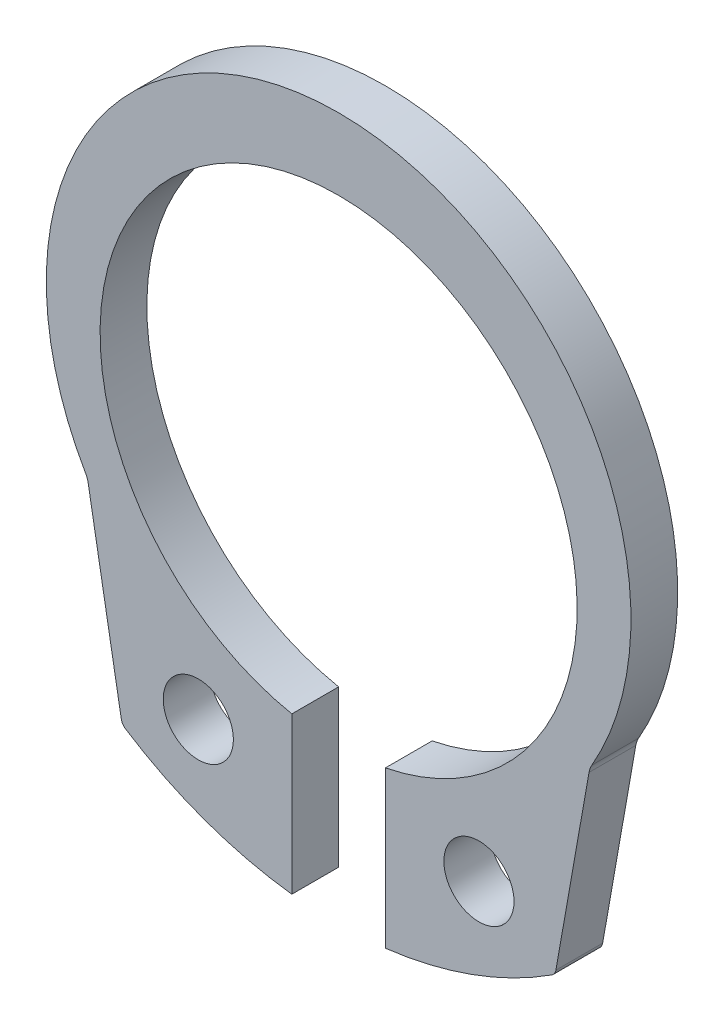
ISO-10303-21;
HEADER;
FILE_DESCRIPTION(('STEP AP214'),'2;1');
FILE_NAME('part.step','',(''),(''),'','','');
FILE_SCHEMA(('AUTOMOTIVE_DESIGN { 1 0 10303 214 1 1 1 1 }'));
ENDSEC;
DATA;
#1=APPLICATION_CONTEXT('core data for automotive mechanical design processes');
#2=APPLICATION_PROTOCOL_DEFINITION('international standard','automotive_design',2000,#1);
#3=PRODUCT_CONTEXT('',#1,'mechanical');
#4=PRODUCT('Part','Part','',(#3));
#5=PRODUCT_RELATED_PRODUCT_CATEGORY('part','',(#4));
#6=PRODUCT_DEFINITION_FORMATION('','',#4);
#7=PRODUCT_DEFINITION_CONTEXT('part definition',#1,'design');
#8=PRODUCT_DEFINITION('design','',#6,#7);
#9=PRODUCT_DEFINITION_SHAPE('','',#8);
#10=(LENGTH_UNIT() NAMED_UNIT(*) SI_UNIT(.MILLI.,.METRE.));
#11=(NAMED_UNIT(*) PLANE_ANGLE_UNIT() SI_UNIT($,.RADIAN.));
#12=(NAMED_UNIT(*) SI_UNIT($,.STERADIAN.) SOLID_ANGLE_UNIT());
#13=UNCERTAINTY_MEASURE_WITH_UNIT(LENGTH_MEASURE(1.E-05),#10,'distance_accuracy_value','');
#14=(GEOMETRIC_REPRESENTATION_CONTEXT(3) GLOBAL_UNCERTAINTY_ASSIGNED_CONTEXT((#13)) GLOBAL_UNIT_ASSIGNED_CONTEXT((#10,
#11,#12)) REPRESENTATION_CONTEXT('',''));
#15=CARTESIAN_POINT('',(0.,0.,0.));
#16=DIRECTION('',(0.,0.,1.));
#17=DIRECTION('',(1.,0.,0.));
#18=AXIS2_PLACEMENT_3D('',#15,#16,#17);
#19=CARTESIAN_POINT('',(0.,-0.38,-1.));
#20=DIRECTION('',(0.,0.,-1.));
#21=DIRECTION('',(-1.,0.,0.));
#22=AXIS2_PLACEMENT_3D('',#19,#20,#21);
#23=PLANE('',#22);
#24=CARTESIAN_POINT('',(0.,-0.38,-1.));
#25=DIRECTION('',(0.,0.,1.));
#26=DIRECTION('',(1.,0.,0.));
#27=AXIS2_PLACEMENT_3D('',#24,#25,#26);
#28=CIRCLE('',#27,5.1);
#29=CARTESIAN_POINT('',(1.,-5.38099990001999,-1.));
#30=VERTEX_POINT('',#29);
#31=CARTESIAN_POINT('',(-1.,-5.38099990001999,-1.));
#32=VERTEX_POINT('',#31);
#33=EDGE_CURVE('E138',#30,#32,#28,.T.);
#34=ORIENTED_EDGE('',*,*,#33,.T.);
#35=DIRECTION('',(0.,1.,0.));
#36=VECTOR('',#35,1.);
#37=CARTESIAN_POINT('',(-1.,-5.38099990001999,-1.));
#38=LINE('',#37,#36);
#39=CARTESIAN_POINT('',(-1.,-8.72026378479722,-1.));
#40=VERTEX_POINT('',#39);
#41=EDGE_CURVE('E140',#40,#32,#38,.T.);
#42=ORIENTED_EDGE('',*,*,#41,.F.);
#43=CARTESIAN_POINT('',(0.,-0.38,-1.));
#44=DIRECTION('',(0.,0.,1.));
#45=DIRECTION('',(1.,0.,0.));
#46=AXIS2_PLACEMENT_3D('',#43,#44,#45);
#47=CIRCLE('',#46,8.4);
#48=CARTESIAN_POINT('',(-4.55722248296452,-7.43632505209069,-1.));
#49=VERTEX_POINT('',#48);
#50=EDGE_CURVE('E135',#49,#40,#47,.T.);
#51=ORIENTED_EDGE('',*,*,#50,.F.);
#52=CARTESIAN_POINT('',(-4.44871718575108,-7.2683173127552,-1.));
#53=DIRECTION('',(0.,0.,1.));
#54=DIRECTION('',(1.,0.,0.));
#55=AXIS2_PLACEMENT_3D('',#52,#53,#54);
#56=CIRCLE('',#55,0.2);
#57=CARTESIAN_POINT('',(-4.64567873635352,-7.30304694828859,-1.));
#58=VERTEX_POINT('',#57);
#59=EDGE_CURVE('E131',#58,#49,#56,.T.);
#60=ORIENTED_EDGE('',*,*,#59,.F.);
#61=DIRECTION('',(0.173648177666932,-0.984807753012208,0.));
#62=VECTOR('',#61,1.);
#63=CARTESIAN_POINT('',(-5.36936571907662,-3.19881412007713,-1.));
#64=LINE('',#63,#62);
#65=CARTESIAN_POINT('',(-5.35375889479579,-3.28732481888293,-1.));
#66=VERTEX_POINT('',#65);
#67=EDGE_CURVE('E193',#66,#58,#64,.T.);
#68=ORIENTED_EDGE('',*,*,#67,.F.);
#69=CARTESIAN_POINT('',(-5.8461627713019,-3.37414890771639,-1.));
#70=DIRECTION('',(0.,0.,1.));
#71=DIRECTION('',(1.,0.,0.));
#72=AXIS2_PLACEMENT_3D('',#69,#70,#71);
#73=CIRCLE('',#72,0.5);
#74=CARTESIAN_POINT('',(-5.41311367713139,-3.12421195158925,-1.));
#75=VERTEX_POINT('',#74);
#76=EDGE_CURVE('E123',#66,#75,#73,.T.);
#77=ORIENTED_EDGE('',*,*,#76,.T.);
#78=CARTESIAN_POINT('',(0.,0.,-1.));
#79=DIRECTION('',(0.,0.,1.));
#80=DIRECTION('',(1.,0.,0.));
#81=AXIS2_PLACEMENT_3D('',#78,#79,#80);
#82=CIRCLE('',#81,6.25);
#83=CARTESIAN_POINT('',(5.41311367713139,-3.12421195158925,-1.));
#84=VERTEX_POINT('',#83);
#85=EDGE_CURVE('E115',#84,#75,#82,.T.);
#86=ORIENTED_EDGE('',*,*,#85,.F.);
#87=CARTESIAN_POINT('',(5.8461627713019,-3.37414890771639,-1.));
#88=DIRECTION('',(0.,0.,1.));
#89=DIRECTION('',(1.,0.,0.));
#90=AXIS2_PLACEMENT_3D('',#87,#88,#89);
#91=CIRCLE('',#90,0.5);
#92=CARTESIAN_POINT('',(5.3537588947958,-3.28732481888293,-1.));
#93=VERTEX_POINT('',#92);
#94=EDGE_CURVE('E102',#84,#93,#91,.T.);
#95=ORIENTED_EDGE('',*,*,#94,.T.);
#96=DIRECTION('',(0.173648177666932,0.984807753012208,0.));
#97=VECTOR('',#96,1.);
#98=CARTESIAN_POINT('',(5.36936571907662,-3.19881412007713,-1.));
#99=LINE('',#98,#97);
#100=CARTESIAN_POINT('',(4.64567873635352,-7.30304694828858,-1.));
#101=VERTEX_POINT('',#100);
#102=EDGE_CURVE('E111',#101,#93,#99,.T.);
#103=ORIENTED_EDGE('',*,*,#102,.F.);
#104=CARTESIAN_POINT('',(4.44871718575108,-7.2683173127552,-1.));
#105=DIRECTION('',(0.,0.,1.));
#106=DIRECTION('',(1.,0.,0.));
#107=AXIS2_PLACEMENT_3D('',#104,#105,#106);
#108=CIRCLE('',#107,0.2);
#109=CARTESIAN_POINT('',(4.55722248296452,-7.43632505209069,-1.));
#110=VERTEX_POINT('',#109);
#111=EDGE_CURVE('E146',#110,#101,#108,.T.);
#112=ORIENTED_EDGE('',*,*,#111,.F.);
#113=CARTESIAN_POINT('',(0.,-0.38,-1.));
#114=DIRECTION('',(0.,0.,1.));
#115=DIRECTION('',(1.,0.,0.));
#116=AXIS2_PLACEMENT_3D('',#113,#114,#115);
#117=CIRCLE('',#116,8.4);
#118=CARTESIAN_POINT('',(1.,-8.72026378479722,-1.));
#119=VERTEX_POINT('',#118);
#120=EDGE_CURVE('E142',#119,#110,#117,.T.);
#121=ORIENTED_EDGE('',*,*,#120,.F.);
#122=DIRECTION('',(0.,1.,0.));
#123=VECTOR('',#122,1.);
#124=CARTESIAN_POINT('',(1.,-5.38099990001999,-1.));
#125=LINE('',#124,#123);
#126=EDGE_CURVE('E189',#30,#119,#125,.F.);
#127=ORIENTED_EDGE('',*,*,#126,.F.);
#128=EDGE_LOOP('',(#34,#42,#51,#60,#68,#77,#86,#95,#103,#112,#121,#127));
#129=FACE_BOUND('',#128,.T.);
#130=CARTESIAN_POINT('',(-3.,-6.48245852095694,-1.));
#131=DIRECTION('',(0.,0.,1.));
#132=DIRECTION('',(1.,0.,0.));
#133=AXIS2_PLACEMENT_3D('',#130,#131,#132);
#134=CIRCLE('',#133,0.75);
#135=CARTESIAN_POINT('',(-2.25,-6.48245852095694,-1.));
#136=VERTEX_POINT('',#135);
#137=EDGE_CURVE('E112',#136,#136,#134,.T.);
#138=ORIENTED_EDGE('',*,*,#137,.T.);
#139=EDGE_LOOP('',(#138));
#140=FACE_BOUND('',#139,.T.);
#141=CARTESIAN_POINT('',(3.,-6.48245852095694,-1.));
#142=DIRECTION('',(0.,0.,1.));
#143=DIRECTION('',(1.,0.,0.));
#144=AXIS2_PLACEMENT_3D('',#141,#142,#143);
#145=CIRCLE('',#144,0.75);
#146=CARTESIAN_POINT('',(3.75,-6.48245852095694,-1.));
#147=VERTEX_POINT('',#146);
#148=EDGE_CURVE('E20',#147,#147,#145,.T.);
#149=ORIENTED_EDGE('',*,*,#148,.T.);
#150=EDGE_LOOP('',(#149));
#151=FACE_BOUND('',#150,.T.);
#152=ADVANCED_FACE('F17',(#129,#140,#151),#23,.T.);
#153=CARTESIAN_POINT('',(3.,-6.48245852095694,-1.));
#154=DIRECTION('',(0.,0.,1.));
#155=DIRECTION('',(1.,0.,0.));
#156=AXIS2_PLACEMENT_3D('',#153,#154,#155);
#157=CYLINDRICAL_SURFACE('',#156,0.75);
#158=ORIENTED_EDGE('',*,*,#148,.F.);
#159=EDGE_LOOP('',(#158));
#160=FACE_BOUND('',#159,.T.);
#161=CARTESIAN_POINT('',(3.,-6.48245852095694,0.));
#162=DIRECTION('',(0.,0.,1.));
#163=DIRECTION('',(1.,0.,0.));
#164=AXIS2_PLACEMENT_3D('',#161,#162,#163);
#165=CIRCLE('',#164,0.75);
#166=CARTESIAN_POINT('',(3.75,-6.48245852095694,0.));
#167=VERTEX_POINT('',#166);
#168=EDGE_CURVE('E118',#167,#167,#165,.T.);
#169=ORIENTED_EDGE('',*,*,#168,.T.);
#170=EDGE_LOOP('',(#169));
#171=FACE_BOUND('',#170,.T.);
#172=ADVANCED_FACE('F153',(#160,#171),#157,.F.);
#173=CARTESIAN_POINT('',(-3.,-6.48245852095694,-1.));
#174=DIRECTION('',(0.,0.,1.));
#175=DIRECTION('',(1.,0.,0.));
#176=AXIS2_PLACEMENT_3D('',#173,#174,#175);
#177=CYLINDRICAL_SURFACE('',#176,0.75);
#178=ORIENTED_EDGE('',*,*,#137,.F.);
#179=EDGE_LOOP('',(#178));
#180=FACE_BOUND('',#179,.T.);
#181=CARTESIAN_POINT('',(-3.,-6.48245852095694,0.));
#182=DIRECTION('',(0.,0.,1.));
#183=DIRECTION('',(1.,0.,0.));
#184=AXIS2_PLACEMENT_3D('',#181,#182,#183);
#185=CIRCLE('',#184,0.75);
#186=CARTESIAN_POINT('',(-2.25,-6.48245852095694,0.));
#187=VERTEX_POINT('',#186);
#188=EDGE_CURVE('E160',#187,#187,#185,.T.);
#189=ORIENTED_EDGE('',*,*,#188,.T.);
#190=EDGE_LOOP('',(#189));
#191=FACE_BOUND('',#190,.T.);
#192=ADVANCED_FACE('F156',(#180,#191),#177,.F.);
#193=CARTESIAN_POINT('',(5.8461627713019,-3.37414890771639,-1.));
#194=DIRECTION('',(0.,0.,1.));
#195=DIRECTION('',(1.,0.,0.));
#196=AXIS2_PLACEMENT_3D('',#193,#194,#195);
#197=CYLINDRICAL_SURFACE('',#196,0.5);
#198=DIRECTION('',(0.,0.,1.));
#199=VECTOR('',#198,1.);
#200=CARTESIAN_POINT('',(5.41311367713139,-3.12421195158925,-1.));
#201=LINE('',#200,#199);
#202=CARTESIAN_POINT('',(5.41311367713139,-3.12421195158925,0.));
#203=VERTEX_POINT('',#202);
#204=EDGE_CURVE('E106',#203,#84,#201,.F.);
#205=ORIENTED_EDGE('',*,*,#204,.F.);
#206=CARTESIAN_POINT('',(5.8461627713019,-3.37414890771639,0.));
#207=DIRECTION('',(0.,0.,1.));
#208=DIRECTION('',(1.,0.,0.));
#209=AXIS2_PLACEMENT_3D('',#206,#207,#208);
#210=CIRCLE('',#209,0.5);
#211=CARTESIAN_POINT('',(5.3537588947958,-3.28732481888293,0.));
#212=VERTEX_POINT('',#211);
#213=EDGE_CURVE('E162',#203,#212,#210,.T.);
#214=ORIENTED_EDGE('',*,*,#213,.T.);
#215=DIRECTION('',(0.,0.,1.));
#216=VECTOR('',#215,1.);
#217=CARTESIAN_POINT('',(5.3537588947958,-3.28732481888293,-1.));
#218=LINE('',#217,#216);
#219=EDGE_CURVE('E107',#93,#212,#218,.T.);
#220=ORIENTED_EDGE('',*,*,#219,.F.);
#221=ORIENTED_EDGE('',*,*,#94,.F.);
#222=EDGE_LOOP('',(#205,#214,#220,#221));
#223=FACE_BOUND('',#222,.T.);
#224=ADVANCED_FACE('F104',(#223),#197,.F.);
#225=CARTESIAN_POINT('',(5.36936571907662,-3.19881412007713,-1.));
#226=DIRECTION('',(0.984807753012208,-0.173648177666932,0.));
#227=DIRECTION('',(0.173648177666932,0.984807753012208,0.));
#228=AXIS2_PLACEMENT_3D('',#225,#226,#227);
#229=PLANE('',#228);
#230=DIRECTION('',(-0.173648177666931,-0.984807753012208,0.));
#231=VECTOR('',#230,1.);
#232=CARTESIAN_POINT('',(5.3537588947958,-3.28732481888293,0.));
#233=LINE('',#232,#231);
#234=CARTESIAN_POINT('',(4.64567873635352,-7.30304694828858,0.));
#235=VERTEX_POINT('',#234);
#236=EDGE_CURVE('E165',#212,#235,#233,.T.);
#237=ORIENTED_EDGE('',*,*,#236,.T.);
#238=DIRECTION('',(0.,0.,1.));
#239=VECTOR('',#238,1.);
#240=CARTESIAN_POINT('',(4.64567873635352,-7.30304694828858,-1.));
#241=LINE('',#240,#239);
#242=EDGE_CURVE('E145',#101,#235,#241,.T.);
#243=ORIENTED_EDGE('',*,*,#242,.F.);
#244=ORIENTED_EDGE('',*,*,#102,.T.);
#245=ORIENTED_EDGE('',*,*,#219,.T.);
#246=EDGE_LOOP('',(#237,#243,#244,#245));
#247=FACE_BOUND('',#246,.T.);
#248=ADVANCED_FACE('F259',(#247),#229,.T.);
#249=CARTESIAN_POINT('',(4.44871718575108,-7.2683173127552,-1.));
#250=DIRECTION('',(0.,0.,1.));
#251=DIRECTION('',(1.,0.,0.));
#252=AXIS2_PLACEMENT_3D('',#249,#250,#251);
#253=CYLINDRICAL_SURFACE('',#252,0.2);
#254=CARTESIAN_POINT('',(4.44871718575108,-7.2683173127552,0.));
#255=DIRECTION('',(0.,0.,1.));
#256=DIRECTION('',(1.,0.,0.));
#257=AXIS2_PLACEMENT_3D('',#254,#255,#256);
#258=CIRCLE('',#257,0.2);
#259=CARTESIAN_POINT('',(4.55722248296452,-7.43632505209069,0.));
#260=VERTEX_POINT('',#259);
#261=EDGE_CURVE('E168',#235,#260,#258,.F.);
#262=ORIENTED_EDGE('',*,*,#261,.T.);
#263=DIRECTION('',(0.,0.,1.));
#264=VECTOR('',#263,1.);
#265=CARTESIAN_POINT('',(4.55722248296452,-7.43632505209069,-1.));
#266=LINE('',#265,#264);
#267=EDGE_CURVE('E144',#110,#260,#266,.T.);
#268=ORIENTED_EDGE('',*,*,#267,.F.);
#269=ORIENTED_EDGE('',*,*,#111,.T.);
#270=ORIENTED_EDGE('',*,*,#242,.T.);
#271=EDGE_LOOP('',(#262,#268,#269,#270));
#272=FACE_BOUND('',#271,.T.);
#273=ADVANCED_FACE('F256',(#272),#253,.T.);
#274=CARTESIAN_POINT('',(0.,-0.38,-1.));
#275=DIRECTION('',(0.,0.,1.));
#276=DIRECTION('',(1.,0.,0.));
#277=AXIS2_PLACEMENT_3D('',#274,#275,#276);
#278=CYLINDRICAL_SURFACE('',#277,8.4);
#279=CARTESIAN_POINT('',(0.,-0.38,0.));
#280=DIRECTION('',(0.,0.,1.));
#281=DIRECTION('',(1.,0.,0.));
#282=AXIS2_PLACEMENT_3D('',#279,#280,#281);
#283=CIRCLE('',#282,8.4);
#284=CARTESIAN_POINT('',(1.,-8.72026378479722,0.));
#285=VERTEX_POINT('',#284);
#286=EDGE_CURVE('E171',#260,#285,#283,.F.);
#287=ORIENTED_EDGE('',*,*,#286,.T.);
#288=DIRECTION('',(0.,0.,1.));
#289=VECTOR('',#288,1.);
#290=CARTESIAN_POINT('',(1.,-8.72026378479722,-1.));
#291=LINE('',#290,#289);
#292=EDGE_CURVE('E191',#119,#285,#291,.T.);
#293=ORIENTED_EDGE('',*,*,#292,.F.);
#294=ORIENTED_EDGE('',*,*,#120,.T.);
#295=ORIENTED_EDGE('',*,*,#267,.T.);
#296=EDGE_LOOP('',(#287,#293,#294,#295));
#297=FACE_BOUND('',#296,.T.);
#298=ADVANCED_FACE('F250',(#297),#278,.T.);
#299=CARTESIAN_POINT('',(1.,-5.38099990001999,-1.));
#300=DIRECTION('',(-1.,0.,0.));
#301=DIRECTION('',(0.,0.,1.));
#302=AXIS2_PLACEMENT_3D('',#299,#300,#301);
#303=PLANE('',#302);
#304=ORIENTED_EDGE('',*,*,#126,.T.);
#305=ORIENTED_EDGE('',*,*,#292,.T.);
#306=DIRECTION('',(0.,1.,0.));
#307=VECTOR('',#306,1.);
#308=CARTESIAN_POINT('',(1.,-0.38,0.));
#309=LINE('',#308,#307);
#310=CARTESIAN_POINT('',(1.,-5.38099990001999,0.));
#311=VERTEX_POINT('',#310);
#312=EDGE_CURVE('E174',#285,#311,#309,.T.);
#313=ORIENTED_EDGE('',*,*,#312,.T.);
#314=DIRECTION('',(0.,0.,1.));
#315=VECTOR('',#314,1.);
#316=CARTESIAN_POINT('',(1.,-5.38099990001999,-1.));
#317=LINE('',#316,#315);
#318=EDGE_CURVE('E141',#311,#30,#317,.F.);
#319=ORIENTED_EDGE('',*,*,#318,.T.);
#320=EDGE_LOOP('',(#304,#305,#313,#319));
#321=FACE_BOUND('',#320,.T.);
#322=ADVANCED_FACE('F246',(#321),#303,.T.);
#323=CARTESIAN_POINT('',(0.,-0.38,-1.));
#324=DIRECTION('',(0.,0.,1.));
#325=DIRECTION('',(1.,0.,0.));
#326=AXIS2_PLACEMENT_3D('',#323,#324,#325);
#327=CYLINDRICAL_SURFACE('',#326,5.1);
#328=ORIENTED_EDGE('',*,*,#33,.F.);
#329=ORIENTED_EDGE('',*,*,#318,.F.);
#330=CARTESIAN_POINT('',(0.,-0.38,0.));
#331=DIRECTION('',(0.,0.,1.));
#332=DIRECTION('',(1.,0.,0.));
#333=AXIS2_PLACEMENT_3D('',#330,#331,#332);
#334=CIRCLE('',#333,5.1);
#335=CARTESIAN_POINT('',(-1.,-5.38099990001999,0.));
#336=VERTEX_POINT('',#335);
#337=EDGE_CURVE('E175',#311,#336,#334,.T.);
#338=ORIENTED_EDGE('',*,*,#337,.T.);
#339=DIRECTION('',(0.,0.,-1.));
#340=VECTOR('',#339,1.);
#341=CARTESIAN_POINT('',(-1.,-5.38099990001999,-1.));
#342=LINE('',#341,#340);
#343=EDGE_CURVE('E137',#32,#336,#342,.F.);
#344=ORIENTED_EDGE('',*,*,#343,.F.);
#345=EDGE_LOOP('',(#328,#329,#338,#344));
#346=FACE_BOUND('',#345,.T.);
#347=ADVANCED_FACE('F241',(#346),#327,.F.);
#348=CARTESIAN_POINT('',(-1.,-5.38099990001999,-1.));
#349=DIRECTION('',(1.,0.,0.));
#350=DIRECTION('',(0.,0.,-1.));
#351=AXIS2_PLACEMENT_3D('',#348,#349,#350);
#352=PLANE('',#351);
#353=ORIENTED_EDGE('',*,*,#41,.T.);
#354=ORIENTED_EDGE('',*,*,#343,.T.);
#355=DIRECTION('',(0.,1.,0.));
#356=VECTOR('',#355,1.);
#357=CARTESIAN_POINT('',(-1.,-0.38,0.));
#358=LINE('',#357,#356);
#359=CARTESIAN_POINT('',(-1.,-8.72026378479722,0.));
#360=VERTEX_POINT('',#359);
#361=EDGE_CURVE('E177',#336,#360,#358,.F.);
#362=ORIENTED_EDGE('',*,*,#361,.T.);
#363=DIRECTION('',(0.,0.,1.));
#364=VECTOR('',#363,1.);
#365=CARTESIAN_POINT('',(-1.,-8.72026378479722,-1.));
#366=LINE('',#365,#364);
#367=EDGE_CURVE('E134',#40,#360,#366,.T.);
#368=ORIENTED_EDGE('',*,*,#367,.F.);
#369=EDGE_LOOP('',(#353,#354,#362,#368));
#370=FACE_BOUND('',#369,.T.);
#371=ADVANCED_FACE('F238',(#370),#352,.T.);
#372=CARTESIAN_POINT('',(0.,-0.38,-1.));
#373=DIRECTION('',(0.,0.,1.));
#374=DIRECTION('',(1.,0.,0.));
#375=AXIS2_PLACEMENT_3D('',#372,#373,#374);
#376=CYLINDRICAL_SURFACE('',#375,8.4);
#377=ORIENTED_EDGE('',*,*,#50,.T.);
#378=ORIENTED_EDGE('',*,*,#367,.T.);
#379=CARTESIAN_POINT('',(0.,-0.38,0.));
#380=DIRECTION('',(0.,0.,1.));
#381=DIRECTION('',(1.,0.,0.));
#382=AXIS2_PLACEMENT_3D('',#379,#380,#381);
#383=CIRCLE('',#382,8.4);
#384=CARTESIAN_POINT('',(-4.55722248296452,-7.43632505209069,0.));
#385=VERTEX_POINT('',#384);
#386=EDGE_CURVE('E178',#360,#385,#383,.F.);
#387=ORIENTED_EDGE('',*,*,#386,.T.);
#388=DIRECTION('',(0.,0.,1.));
#389=VECTOR('',#388,1.);
#390=CARTESIAN_POINT('',(-4.55722248296452,-7.43632505209069,-1.));
#391=LINE('',#390,#389);
#392=EDGE_CURVE('E133',#49,#385,#391,.T.);
#393=ORIENTED_EDGE('',*,*,#392,.F.);
#394=EDGE_LOOP('',(#377,#378,#387,#393));
#395=FACE_BOUND('',#394,.T.);
#396=ADVANCED_FACE('F232',(#395),#376,.T.);
#397=CARTESIAN_POINT('',(-4.44871718575108,-7.2683173127552,-1.));
#398=DIRECTION('',(0.,0.,1.));
#399=DIRECTION('',(1.,0.,0.));
#400=AXIS2_PLACEMENT_3D('',#397,#398,#399);
#401=CYLINDRICAL_SURFACE('',#400,0.2);
#402=CARTESIAN_POINT('',(-4.44871718575108,-7.2683173127552,0.));
#403=DIRECTION('',(0.,0.,1.));
#404=DIRECTION('',(1.,0.,0.));
#405=AXIS2_PLACEMENT_3D('',#402,#403,#404);
#406=CIRCLE('',#405,0.2);
#407=CARTESIAN_POINT('',(-4.64567873635352,-7.30304694828859,0.));
#408=VERTEX_POINT('',#407);
#409=EDGE_CURVE('E181',#385,#408,#406,.F.);
#410=ORIENTED_EDGE('',*,*,#409,.T.);
#411=DIRECTION('',(0.,0.,1.));
#412=VECTOR('',#411,1.);
#413=CARTESIAN_POINT('',(-4.64567873635352,-7.30304694828859,-1.));
#414=LINE('',#413,#412);
#415=EDGE_CURVE('E195',#58,#408,#414,.T.);
#416=ORIENTED_EDGE('',*,*,#415,.F.);
#417=ORIENTED_EDGE('',*,*,#59,.T.);
#418=ORIENTED_EDGE('',*,*,#392,.T.);
#419=EDGE_LOOP('',(#410,#416,#417,#418));
#420=FACE_BOUND('',#419,.T.);
#421=ADVANCED_FACE('F227',(#420),#401,.T.);
#422=CARTESIAN_POINT('',(-5.36936571907662,-3.19881412007713,-1.));
#423=DIRECTION('',(-0.984807753012208,-0.173648177666932,0.));
#424=DIRECTION('',(0.173648177666932,-0.984807753012208,0.));
#425=AXIS2_PLACEMENT_3D('',#422,#423,#424);
#426=PLANE('',#425);
#427=ORIENTED_EDGE('',*,*,#67,.T.);
#428=ORIENTED_EDGE('',*,*,#415,.T.);
#429=DIRECTION('',(-0.173648177666931,0.984807753012208,0.));
#430=VECTOR('',#429,1.);
#431=CARTESIAN_POINT('',(-4.64567873635352,-7.30304694828858,0.));
#432=LINE('',#431,#430);
#433=CARTESIAN_POINT('',(-5.35375889479579,-3.28732481888293,0.));
#434=VERTEX_POINT('',#433);
#435=EDGE_CURVE('E184',#408,#434,#432,.T.);
#436=ORIENTED_EDGE('',*,*,#435,.T.);
#437=DIRECTION('',(0.,0.,1.));
#438=VECTOR('',#437,1.);
#439=CARTESIAN_POINT('',(-5.35375889479579,-3.28732481888293,-1.));
#440=LINE('',#439,#438);
#441=EDGE_CURVE('E130',#434,#66,#440,.F.);
#442=ORIENTED_EDGE('',*,*,#441,.T.);
#443=EDGE_LOOP('',(#427,#428,#436,#442));
#444=FACE_BOUND('',#443,.T.);
#445=ADVANCED_FACE('F218',(#444),#426,.T.);
#446=CARTESIAN_POINT('',(-5.8461627713019,-3.37414890771639,-1.));
#447=DIRECTION('',(0.,0.,1.));
#448=DIRECTION('',(1.,0.,0.));
#449=AXIS2_PLACEMENT_3D('',#446,#447,#448);
#450=CYLINDRICAL_SURFACE('',#449,0.5);
#451=ORIENTED_EDGE('',*,*,#441,.F.);
#452=CARTESIAN_POINT('',(-5.8461627713019,-3.37414890771639,0.));
#453=DIRECTION('',(0.,0.,1.));
#454=DIRECTION('',(1.,0.,0.));
#455=AXIS2_PLACEMENT_3D('',#452,#453,#454);
#456=CIRCLE('',#455,0.5);
#457=CARTESIAN_POINT('',(-5.41311367713139,-3.12421195158925,0.));
#458=VERTEX_POINT('',#457);
#459=EDGE_CURVE('E26',#434,#458,#456,.T.);
#460=ORIENTED_EDGE('',*,*,#459,.T.);
#461=DIRECTION('',(0.,0.,1.));
#462=VECTOR('',#461,1.);
#463=CARTESIAN_POINT('',(-5.41311367713139,-3.12421195158925,-1.));
#464=LINE('',#463,#462);
#465=EDGE_CURVE('E34',#75,#458,#464,.T.);
#466=ORIENTED_EDGE('',*,*,#465,.F.);
#467=ORIENTED_EDGE('',*,*,#76,.F.);
#468=EDGE_LOOP('',(#451,#460,#466,#467));
#469=FACE_BOUND('',#468,.T.);
#470=ADVANCED_FACE('F261',(#469),#450,.F.);
#471=CARTESIAN_POINT('',(0.,0.,-1.));
#472=DIRECTION('',(0.,0.,1.));
#473=DIRECTION('',(1.,0.,0.));
#474=AXIS2_PLACEMENT_3D('',#471,#472,#473);
#475=CYLINDRICAL_SURFACE('',#474,6.25);
#476=CARTESIAN_POINT('',(0.,0.,0.));
#477=DIRECTION('',(0.,0.,1.));
#478=DIRECTION('',(1.,0.,0.));
#479=AXIS2_PLACEMENT_3D('',#476,#477,#478);
#480=CIRCLE('',#479,6.25);
#481=EDGE_CURVE('E11',#458,#203,#480,.F.);
#482=ORIENTED_EDGE('',*,*,#481,.T.);
#483=ORIENTED_EDGE('',*,*,#204,.T.);
#484=ORIENTED_EDGE('',*,*,#85,.T.);
#485=ORIENTED_EDGE('',*,*,#465,.T.);
#486=EDGE_LOOP('',(#482,#483,#484,#485));
#487=FACE_BOUND('',#486,.T.);
#488=ADVANCED_FACE('F114',(#487),#475,.T.);
#489=CARTESIAN_POINT('',(0.,-0.38,0.));
#490=DIRECTION('',(0.,0.,-1.));
#491=DIRECTION('',(-1.,0.,0.));
#492=AXIS2_PLACEMENT_3D('',#489,#490,#491);
#493=PLANE('',#492);
#494=ORIENTED_EDGE('',*,*,#213,.F.);
#495=ORIENTED_EDGE('',*,*,#481,.F.);
#496=ORIENTED_EDGE('',*,*,#459,.F.);
#497=ORIENTED_EDGE('',*,*,#435,.F.);
#498=ORIENTED_EDGE('',*,*,#409,.F.);
#499=ORIENTED_EDGE('',*,*,#386,.F.);
#500=ORIENTED_EDGE('',*,*,#361,.F.);
#501=ORIENTED_EDGE('',*,*,#337,.F.);
#502=ORIENTED_EDGE('',*,*,#312,.F.);
#503=ORIENTED_EDGE('',*,*,#286,.F.);
#504=ORIENTED_EDGE('',*,*,#261,.F.);
#505=ORIENTED_EDGE('',*,*,#236,.F.);
#506=EDGE_LOOP('',(#494,#495,#496,#497,#498,#499,#500,#501,#502,#503,#504,#505));
#507=FACE_BOUND('',#506,.T.);
#508=ORIENTED_EDGE('',*,*,#188,.F.);
#509=EDGE_LOOP('',(#508));
#510=FACE_BOUND('',#509,.T.);
#511=ORIENTED_EDGE('',*,*,#168,.F.);
#512=EDGE_LOOP('',(#511));
#513=FACE_BOUND('',#512,.T.);
#514=ADVANCED_FACE('F223',(#507,#510,#513),#493,.F.);
#515=CLOSED_SHELL('',(#152,#172,#192,#224,#248,#273,#298,#322,#347,#371,#396,#421,#445,#470,
#488,#514));
#516=MANIFOLD_SOLID_BREP('B1',#515);
#517=ADVANCED_BREP_SHAPE_REPRESENTATION('',(#18,#516),#14);
#518=SHAPE_DEFINITION_REPRESENTATION(#9,#517);
ENDSEC;
END-ISO-10303-21;
